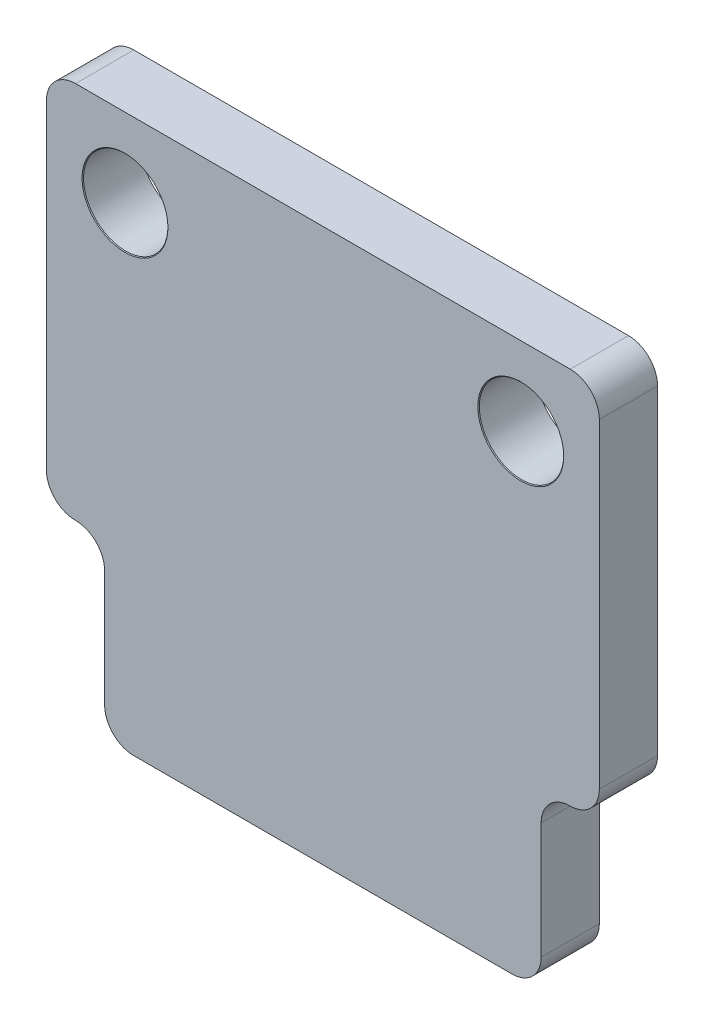
ISO-10303-21;
HEADER;
FILE_DESCRIPTION(('STEP AP214'),'2;1');
FILE_NAME('part.step','',(''),(''),'','','');
FILE_SCHEMA(('AUTOMOTIVE_DESIGN { 1 0 10303 214 1 1 1 1 }'));
ENDSEC;
DATA;
#1=APPLICATION_CONTEXT('core data for automotive mechanical design processes');
#2=APPLICATION_PROTOCOL_DEFINITION('international standard','automotive_design',2000,#1);
#3=PRODUCT_CONTEXT('',#1,'mechanical');
#4=PRODUCT('Part','Part','',(#3));
#5=PRODUCT_RELATED_PRODUCT_CATEGORY('part','',(#4));
#6=PRODUCT_DEFINITION_FORMATION('','',#4);
#7=PRODUCT_DEFINITION_CONTEXT('part definition',#1,'design');
#8=PRODUCT_DEFINITION('design','',#6,#7);
#9=PRODUCT_DEFINITION_SHAPE('','',#8);
#10=(LENGTH_UNIT() NAMED_UNIT(*) SI_UNIT(.MILLI.,.METRE.));
#11=(NAMED_UNIT(*) PLANE_ANGLE_UNIT() SI_UNIT($,.RADIAN.));
#12=(NAMED_UNIT(*) SI_UNIT($,.STERADIAN.) SOLID_ANGLE_UNIT());
#13=UNCERTAINTY_MEASURE_WITH_UNIT(LENGTH_MEASURE(1.E-05),#10,'distance_accuracy_value','');
#14=(GEOMETRIC_REPRESENTATION_CONTEXT(3) GLOBAL_UNCERTAINTY_ASSIGNED_CONTEXT((#13)) GLOBAL_UNIT_ASSIGNED_CONTEXT((#10,
#11,#12)) REPRESENTATION_CONTEXT('',''));
#15=CARTESIAN_POINT('',(0.,0.,0.));
#16=DIRECTION('',(0.,0.,1.));
#17=DIRECTION('',(1.,0.,0.));
#18=AXIS2_PLACEMENT_3D('',#15,#16,#17);
#19=CARTESIAN_POINT('',(7.5,0.,2.));
#20=DIRECTION('',(0.,1.,0.));
#21=DIRECTION('',(0.,0.,1.));
#22=AXIS2_PLACEMENT_3D('',#19,#20,#21);
#23=PLANE('',#22);
#24=DIRECTION('',(1.,0.,0.));
#25=VECTOR('',#24,1.);
#26=CARTESIAN_POINT('',(7.5,0.,0.));
#27=LINE('',#26,#25);
#28=CARTESIAN_POINT('',(-6.5,0.,0.));
#29=VERTEX_POINT('',#28);
#30=CARTESIAN_POINT('',(6.5,0.,0.));
#31=VERTEX_POINT('',#30);
#32=EDGE_CURVE('E227',#29,#31,#27,.T.);
#33=ORIENTED_EDGE('',*,*,#32,.T.);
#34=DIRECTION('',(0.,0.,-1.));
#35=VECTOR('',#34,1.);
#36=CARTESIAN_POINT('',(6.5,0.,2.));
#37=LINE('',#36,#35);
#38=CARTESIAN_POINT('',(6.5,0.,2.));
#39=VERTEX_POINT('',#38);
#40=EDGE_CURVE('E210',#31,#39,#37,.F.);
#41=ORIENTED_EDGE('',*,*,#40,.T.);
#42=DIRECTION('',(1.,0.,0.));
#43=VECTOR('',#42,1.);
#44=CARTESIAN_POINT('',(7.5,0.,2.));
#45=LINE('',#44,#43);
#46=CARTESIAN_POINT('',(-6.5,0.,2.));
#47=VERTEX_POINT('',#46);
#48=EDGE_CURVE('E176',#47,#39,#45,.T.);
#49=ORIENTED_EDGE('',*,*,#48,.F.);
#50=DIRECTION('',(0.,0.,-1.));
#51=VECTOR('',#50,1.);
#52=CARTESIAN_POINT('',(-6.5,0.,2.));
#53=LINE('',#52,#51);
#54=EDGE_CURVE('E207',#47,#29,#53,.T.);
#55=ORIENTED_EDGE('',*,*,#54,.T.);
#56=EDGE_LOOP('',(#33,#41,#49,#55));
#57=FACE_BOUND('',#56,.T.);
#58=ADVANCED_FACE('F37',(#57),#23,.F.);
#59=CARTESIAN_POINT('',(7.5,6.,2.));
#60=DIRECTION('',(-1.,0.,0.));
#61=DIRECTION('',(0.,-1.,0.));
#62=AXIS2_PLACEMENT_3D('',#59,#60,#61);
#63=PLANE('',#62);
#64=DIRECTION('',(0.,1.,0.));
#65=VECTOR('',#64,1.);
#66=CARTESIAN_POINT('',(7.5,6.,0.));
#67=LINE('',#66,#65);
#68=CARTESIAN_POINT('',(7.5,1.,0.));
#69=VERTEX_POINT('',#68);
#70=CARTESIAN_POINT('',(7.5,5.,0.));
#71=VERTEX_POINT('',#70);
#72=EDGE_CURVE('E171',#69,#71,#67,.T.);
#73=ORIENTED_EDGE('',*,*,#72,.T.);
#74=DIRECTION('',(0.,0.,-1.));
#75=VECTOR('',#74,1.);
#76=CARTESIAN_POINT('',(7.5,5.,2.));
#77=LINE('',#76,#75);
#78=CARTESIAN_POINT('',(7.5,5.,2.));
#79=VERTEX_POINT('',#78);
#80=EDGE_CURVE('E205',#71,#79,#77,.F.);
#81=ORIENTED_EDGE('',*,*,#80,.T.);
#82=DIRECTION('',(0.,1.,0.));
#83=VECTOR('',#82,1.);
#84=CARTESIAN_POINT('',(7.5,6.,2.));
#85=LINE('',#84,#83);
#86=CARTESIAN_POINT('',(7.5,1.,2.));
#87=VERTEX_POINT('',#86);
#88=EDGE_CURVE('E249',#87,#79,#85,.T.);
#89=ORIENTED_EDGE('',*,*,#88,.F.);
#90=DIRECTION('',(0.,0.,-1.));
#91=VECTOR('',#90,1.);
#92=CARTESIAN_POINT('',(7.5,1.,2.));
#93=LINE('',#92,#91);
#94=EDGE_CURVE('E202',#87,#69,#93,.T.);
#95=ORIENTED_EDGE('',*,*,#94,.T.);
#96=EDGE_LOOP('',(#73,#81,#89,#95));
#97=FACE_BOUND('',#96,.T.);
#98=ADVANCED_FACE('F263',(#97),#63,.F.);
#99=CARTESIAN_POINT('',(9.5,19.,2.));
#100=DIRECTION('',(-1.,0.,0.));
#101=DIRECTION('',(0.,-1.,0.));
#102=AXIS2_PLACEMENT_3D('',#99,#100,#101);
#103=PLANE('',#102);
#104=DIRECTION('',(0.,1.,0.));
#105=VECTOR('',#104,1.);
#106=CARTESIAN_POINT('',(9.5,19.,0.));
#107=LINE('',#106,#105);
#108=CARTESIAN_POINT('',(9.5,7.,0.));
#109=VERTEX_POINT('',#108);
#110=CARTESIAN_POINT('',(9.5,18.,0.));
#111=VERTEX_POINT('',#110);
#112=EDGE_CURVE('E166',#109,#111,#107,.T.);
#113=ORIENTED_EDGE('',*,*,#112,.T.);
#114=DIRECTION('',(0.,0.,-1.));
#115=VECTOR('',#114,1.);
#116=CARTESIAN_POINT('',(9.5,18.,2.));
#117=LINE('',#116,#115);
#118=CARTESIAN_POINT('',(9.5,18.,2.));
#119=VERTEX_POINT('',#118);
#120=EDGE_CURVE('E144',#111,#119,#117,.F.);
#121=ORIENTED_EDGE('',*,*,#120,.T.);
#122=DIRECTION('',(0.,1.,0.));
#123=VECTOR('',#122,1.);
#124=CARTESIAN_POINT('',(9.5,19.,2.));
#125=LINE('',#124,#123);
#126=CARTESIAN_POINT('',(9.5,7.,2.));
#127=VERTEX_POINT('',#126);
#128=EDGE_CURVE('E252',#127,#119,#125,.T.);
#129=ORIENTED_EDGE('',*,*,#128,.F.);
#130=DIRECTION('',(0.,0.,-1.));
#131=VECTOR('',#130,1.);
#132=CARTESIAN_POINT('',(9.5,7.,2.));
#133=LINE('',#132,#131);
#134=EDGE_CURVE('E149',#127,#109,#133,.T.);
#135=ORIENTED_EDGE('',*,*,#134,.T.);
#136=EDGE_LOOP('',(#113,#121,#129,#135));
#137=FACE_BOUND('',#136,.T.);
#138=ADVANCED_FACE('F313',(#137),#103,.F.);
#139=CARTESIAN_POINT('',(-9.5,19.,2.));
#140=DIRECTION('',(0.,-1.,0.));
#141=DIRECTION('',(0.,0.,-1.));
#142=AXIS2_PLACEMENT_3D('',#139,#140,#141);
#143=PLANE('',#142);
#144=DIRECTION('',(-1.,0.,0.));
#145=VECTOR('',#144,1.);
#146=CARTESIAN_POINT('',(-9.5,19.,2.));
#147=LINE('',#146,#145);
#148=CARTESIAN_POINT('',(8.5,19.,2.));
#149=VERTEX_POINT('',#148);
#150=CARTESIAN_POINT('',(-8.5,19.,2.));
#151=VERTEX_POINT('',#150);
#152=EDGE_CURVE('E159',#149,#151,#147,.T.);
#153=ORIENTED_EDGE('',*,*,#152,.F.);
#154=DIRECTION('',(0.,0.,-1.));
#155=VECTOR('',#154,1.);
#156=CARTESIAN_POINT('',(8.5,19.,2.));
#157=LINE('',#156,#155);
#158=CARTESIAN_POINT('',(8.5,19.,0.));
#159=VERTEX_POINT('',#158);
#160=EDGE_CURVE('E143',#149,#159,#157,.T.);
#161=ORIENTED_EDGE('',*,*,#160,.T.);
#162=DIRECTION('',(-1.,0.,0.));
#163=VECTOR('',#162,1.);
#164=CARTESIAN_POINT('',(-9.5,19.,0.));
#165=LINE('',#164,#163);
#166=CARTESIAN_POINT('',(-8.5,19.,0.));
#167=VERTEX_POINT('',#166);
#168=EDGE_CURVE('E156',#159,#167,#165,.T.);
#169=ORIENTED_EDGE('',*,*,#168,.T.);
#170=DIRECTION('',(0.,0.,-1.));
#171=VECTOR('',#170,1.);
#172=CARTESIAN_POINT('',(-8.5,19.,2.));
#173=LINE('',#172,#171);
#174=EDGE_CURVE('E161',#167,#151,#173,.F.);
#175=ORIENTED_EDGE('',*,*,#174,.T.);
#176=EDGE_LOOP('',(#153,#161,#169,#175));
#177=FACE_BOUND('',#176,.T.);
#178=ADVANCED_FACE('F155',(#177),#143,.F.);
#179=CARTESIAN_POINT('',(-9.5,19.,2.));
#180=DIRECTION('',(1.,0.,0.));
#181=DIRECTION('',(0.,1.,0.));
#182=AXIS2_PLACEMENT_3D('',#179,#180,#181);
#183=PLANE('',#182);
#184=DIRECTION('',(0.,-1.,0.));
#185=VECTOR('',#184,1.);
#186=CARTESIAN_POINT('',(-9.5,19.,0.));
#187=LINE('',#186,#185);
#188=CARTESIAN_POINT('',(-9.5,18.,0.));
#189=VERTEX_POINT('',#188);
#190=CARTESIAN_POINT('',(-9.5,7.,0.));
#191=VERTEX_POINT('',#190);
#192=EDGE_CURVE('E165',#189,#191,#187,.T.);
#193=ORIENTED_EDGE('',*,*,#192,.T.);
#194=DIRECTION('',(0.,0.,-1.));
#195=VECTOR('',#194,1.);
#196=CARTESIAN_POINT('',(-9.5,7.,2.));
#197=LINE('',#196,#195);
#198=CARTESIAN_POINT('',(-9.5,7.,2.));
#199=VERTEX_POINT('',#198);
#200=EDGE_CURVE('E219',#191,#199,#197,.F.);
#201=ORIENTED_EDGE('',*,*,#200,.T.);
#202=DIRECTION('',(0.,-1.,0.));
#203=VECTOR('',#202,1.);
#204=CARTESIAN_POINT('',(-9.5,19.,2.));
#205=LINE('',#204,#203);
#206=CARTESIAN_POINT('',(-9.5,18.,2.));
#207=VERTEX_POINT('',#206);
#208=EDGE_CURVE('E256',#207,#199,#205,.T.);
#209=ORIENTED_EDGE('',*,*,#208,.F.);
#210=DIRECTION('',(0.,0.,-1.));
#211=VECTOR('',#210,1.);
#212=CARTESIAN_POINT('',(-9.5,18.,2.));
#213=LINE('',#212,#211);
#214=EDGE_CURVE('E216',#207,#189,#213,.T.);
#215=ORIENTED_EDGE('',*,*,#214,.T.);
#216=EDGE_LOOP('',(#193,#201,#209,#215));
#217=FACE_BOUND('',#216,.T.);
#218=ADVANCED_FACE('F294',(#217),#183,.F.);
#219=CARTESIAN_POINT('',(-7.5,6.,2.));
#220=DIRECTION('',(1.,0.,0.));
#221=DIRECTION('',(0.,1.,0.));
#222=AXIS2_PLACEMENT_3D('',#219,#220,#221);
#223=PLANE('',#222);
#224=DIRECTION('',(0.,-1.,0.));
#225=VECTOR('',#224,1.);
#226=CARTESIAN_POINT('',(-7.5,6.,0.));
#227=LINE('',#226,#225);
#228=CARTESIAN_POINT('',(-7.5,5.,0.));
#229=VERTEX_POINT('',#228);
#230=CARTESIAN_POINT('',(-7.5,1.,0.));
#231=VERTEX_POINT('',#230);
#232=EDGE_CURVE('E169',#229,#231,#227,.T.);
#233=ORIENTED_EDGE('',*,*,#232,.T.);
#234=DIRECTION('',(0.,0.,-1.));
#235=VECTOR('',#234,1.);
#236=CARTESIAN_POINT('',(-7.5,1.,2.));
#237=LINE('',#236,#235);
#238=CARTESIAN_POINT('',(-7.5,1.,2.));
#239=VERTEX_POINT('',#238);
#240=EDGE_CURVE('E54',#231,#239,#237,.F.);
#241=ORIENTED_EDGE('',*,*,#240,.T.);
#242=DIRECTION('',(0.,-1.,0.));
#243=VECTOR('',#242,1.);
#244=CARTESIAN_POINT('',(-7.5,6.,2.));
#245=LINE('',#244,#243);
#246=CARTESIAN_POINT('',(-7.5,5.,2.));
#247=VERTEX_POINT('',#246);
#248=EDGE_CURVE('E177',#247,#239,#245,.T.);
#249=ORIENTED_EDGE('',*,*,#248,.F.);
#250=DIRECTION('',(0.,0.,-1.));
#251=VECTOR('',#250,1.);
#252=CARTESIAN_POINT('',(-7.5,5.,0.));
#253=LINE('',#252,#251);
#254=EDGE_CURVE('E212',#247,#229,#253,.T.);
#255=ORIENTED_EDGE('',*,*,#254,.T.);
#256=EDGE_LOOP('',(#233,#241,#249,#255));
#257=FACE_BOUND('',#256,.T.);
#258=ADVANCED_FACE('F284',(#257),#223,.F.);
#259=CARTESIAN_POINT('',(0.,0.,2.));
#260=DIRECTION('',(0.,0.,1.));
#261=DIRECTION('',(1.,0.,0.));
#262=AXIS2_PLACEMENT_3D('',#259,#260,#261);
#263=PLANE('',#262);
#264=CARTESIAN_POINT('',(-6.8,16.3,2.));
#265=DIRECTION('',(0.,0.,1.));
#266=DIRECTION('',(1.,0.,0.));
#267=AXIS2_PLACEMENT_3D('',#264,#265,#266);
#268=CIRCLE('',#267,1.475);
#269=CARTESIAN_POINT('',(-5.325,16.3,2.));
#270=VERTEX_POINT('',#269);
#271=EDGE_CURVE('E516',#270,#270,#268,.T.);
#272=ORIENTED_EDGE('',*,*,#271,.F.);
#273=EDGE_LOOP('',(#272));
#274=FACE_BOUND('',#273,.T.);
#275=CARTESIAN_POINT('',(6.8,16.3,2.));
#276=DIRECTION('',(0.,0.,1.));
#277=DIRECTION('',(1.,0.,0.));
#278=AXIS2_PLACEMENT_3D('',#275,#276,#277);
#279=CIRCLE('',#278,1.475);
#280=CARTESIAN_POINT('',(8.275,16.3,2.));
#281=VERTEX_POINT('',#280);
#282=EDGE_CURVE('E243',#281,#281,#279,.T.);
#283=ORIENTED_EDGE('',*,*,#282,.F.);
#284=EDGE_LOOP('',(#283));
#285=FACE_BOUND('',#284,.T.);
#286=ORIENTED_EDGE('',*,*,#128,.T.);
#287=CARTESIAN_POINT('',(8.5,18.,2.));
#288=DIRECTION('',(0.,0.,1.));
#289=DIRECTION('',(1.,0.,0.));
#290=AXIS2_PLACEMENT_3D('',#287,#288,#289);
#291=CIRCLE('',#290,1.);
#292=EDGE_CURVE('E200',#119,#149,#291,.T.);
#293=ORIENTED_EDGE('',*,*,#292,.T.);
#294=ORIENTED_EDGE('',*,*,#152,.T.);
#295=CARTESIAN_POINT('',(-8.5,18.,2.));
#296=DIRECTION('',(0.,0.,1.));
#297=DIRECTION('',(1.,0.,0.));
#298=AXIS2_PLACEMENT_3D('',#295,#296,#297);
#299=CIRCLE('',#298,1.);
#300=EDGE_CURVE('E190',#151,#207,#299,.T.);
#301=ORIENTED_EDGE('',*,*,#300,.T.);
#302=ORIENTED_EDGE('',*,*,#208,.T.);
#303=CARTESIAN_POINT('',(-8.5,7.,2.));
#304=DIRECTION('',(0.,0.,1.));
#305=DIRECTION('',(1.,0.,0.));
#306=AXIS2_PLACEMENT_3D('',#303,#304,#305);
#307=CIRCLE('',#306,1.);
#308=CARTESIAN_POINT('',(-8.5,6.,2.));
#309=VERTEX_POINT('',#308);
#310=EDGE_CURVE('E192',#199,#309,#307,.T.);
#311=ORIENTED_EDGE('',*,*,#310,.T.);
#312=CARTESIAN_POINT('',(-8.5,5.,2.));
#313=DIRECTION('',(0.,0.,1.));
#314=DIRECTION('',(1.,0.,0.));
#315=AXIS2_PLACEMENT_3D('',#312,#313,#314);
#316=CIRCLE('',#315,1.);
#317=EDGE_CURVE('E11',#309,#247,#316,.F.);
#318=ORIENTED_EDGE('',*,*,#317,.T.);
#319=ORIENTED_EDGE('',*,*,#248,.T.);
#320=CARTESIAN_POINT('',(-6.5,1.,2.));
#321=DIRECTION('',(0.,0.,1.));
#322=DIRECTION('',(1.,0.,0.));
#323=AXIS2_PLACEMENT_3D('',#320,#321,#322);
#324=CIRCLE('',#323,1.);
#325=EDGE_CURVE('E194',#239,#47,#324,.T.);
#326=ORIENTED_EDGE('',*,*,#325,.T.);
#327=ORIENTED_EDGE('',*,*,#48,.T.);
#328=CARTESIAN_POINT('',(6.5,1.,2.));
#329=DIRECTION('',(0.,0.,1.));
#330=DIRECTION('',(1.,0.,0.));
#331=AXIS2_PLACEMENT_3D('',#328,#329,#330);
#332=CIRCLE('',#331,1.);
#333=EDGE_CURVE('E196',#39,#87,#332,.T.);
#334=ORIENTED_EDGE('',*,*,#333,.T.);
#335=ORIENTED_EDGE('',*,*,#88,.T.);
#336=CARTESIAN_POINT('',(8.5,5.,2.));
#337=DIRECTION('',(0.,0.,1.));
#338=DIRECTION('',(1.,0.,0.));
#339=AXIS2_PLACEMENT_3D('',#336,#337,#338);
#340=CIRCLE('',#339,1.);
#341=CARTESIAN_POINT('',(8.5,6.,2.));
#342=VERTEX_POINT('',#341);
#343=EDGE_CURVE('E223',#79,#342,#340,.F.);
#344=ORIENTED_EDGE('',*,*,#343,.T.);
#345=CARTESIAN_POINT('',(8.5,7.,2.));
#346=DIRECTION('',(0.,0.,1.));
#347=DIRECTION('',(1.,0.,0.));
#348=AXIS2_PLACEMENT_3D('',#345,#346,#347);
#349=CIRCLE('',#348,1.);
#350=EDGE_CURVE('E198',#342,#127,#349,.T.);
#351=ORIENTED_EDGE('',*,*,#350,.T.);
#352=EDGE_LOOP('',(#286,#293,#294,#301,#302,#311,#318,#319,#326,#327,#334,#335,#344,#351));
#353=FACE_BOUND('',#352,.T.);
#354=ADVANCED_FACE('F270',(#274,#285,#353),#263,.T.);
#355=CARTESIAN_POINT('',(0.,0.,0.));
#356=DIRECTION('',(0.,0.,1.));
#357=DIRECTION('',(1.,0.,0.));
#358=AXIS2_PLACEMENT_3D('',#355,#356,#357);
#359=PLANE('',#358);
#360=CARTESIAN_POINT('',(-6.8,16.3,0.));
#361=DIRECTION('',(0.,0.,1.));
#362=DIRECTION('',(1.,0.,0.));
#363=AXIS2_PLACEMENT_3D('',#360,#361,#362);
#364=CIRCLE('',#363,1.45);
#365=CARTESIAN_POINT('',(-5.35,16.3,0.));
#366=VERTEX_POINT('',#365);
#367=EDGE_CURVE('E518',#366,#366,#364,.T.);
#368=ORIENTED_EDGE('',*,*,#367,.T.);
#369=EDGE_LOOP('',(#368));
#370=FACE_BOUND('',#369,.T.);
#371=CARTESIAN_POINT('',(6.8,16.3,0.));
#372=DIRECTION('',(0.,0.,1.));
#373=DIRECTION('',(1.,0.,0.));
#374=AXIS2_PLACEMENT_3D('',#371,#372,#373);
#375=CIRCLE('',#374,1.45);
#376=CARTESIAN_POINT('',(8.25,16.3,0.));
#377=VERTEX_POINT('',#376);
#378=EDGE_CURVE('E234',#377,#377,#375,.T.);
#379=ORIENTED_EDGE('',*,*,#378,.T.);
#380=EDGE_LOOP('',(#379));
#381=FACE_BOUND('',#380,.T.);
#382=ORIENTED_EDGE('',*,*,#168,.F.);
#383=CARTESIAN_POINT('',(8.5,18.,0.));
#384=DIRECTION('',(0.,0.,1.));
#385=DIRECTION('',(1.,0.,0.));
#386=AXIS2_PLACEMENT_3D('',#383,#384,#385);
#387=CIRCLE('',#386,1.);
#388=EDGE_CURVE('E139',#159,#111,#387,.F.);
#389=ORIENTED_EDGE('',*,*,#388,.T.);
#390=ORIENTED_EDGE('',*,*,#112,.F.);
#391=CARTESIAN_POINT('',(8.5,7.,0.));
#392=DIRECTION('',(0.,0.,1.));
#393=DIRECTION('',(1.,0.,0.));
#394=AXIS2_PLACEMENT_3D('',#391,#392,#393);
#395=CIRCLE('',#394,1.);
#396=CARTESIAN_POINT('',(8.5,6.,0.));
#397=VERTEX_POINT('',#396);
#398=EDGE_CURVE('E150',#109,#397,#395,.F.);
#399=ORIENTED_EDGE('',*,*,#398,.T.);
#400=CARTESIAN_POINT('',(8.5,5.,0.));
#401=DIRECTION('',(0.,0.,1.));
#402=DIRECTION('',(1.,0.,0.));
#403=AXIS2_PLACEMENT_3D('',#400,#401,#402);
#404=CIRCLE('',#403,1.);
#405=EDGE_CURVE('E221',#397,#71,#404,.T.);
#406=ORIENTED_EDGE('',*,*,#405,.T.);
#407=ORIENTED_EDGE('',*,*,#72,.F.);
#408=CARTESIAN_POINT('',(6.5,1.,0.));
#409=DIRECTION('',(0.,0.,1.));
#410=DIRECTION('',(1.,0.,0.));
#411=AXIS2_PLACEMENT_3D('',#408,#409,#410);
#412=CIRCLE('',#411,1.);
#413=EDGE_CURVE('E184',#69,#31,#412,.F.);
#414=ORIENTED_EDGE('',*,*,#413,.T.);
#415=ORIENTED_EDGE('',*,*,#32,.F.);
#416=CARTESIAN_POINT('',(-6.5,1.,0.));
#417=DIRECTION('',(0.,0.,1.));
#418=DIRECTION('',(1.,0.,0.));
#419=AXIS2_PLACEMENT_3D('',#416,#417,#418);
#420=CIRCLE('',#419,1.);
#421=EDGE_CURVE('E182',#29,#231,#420,.F.);
#422=ORIENTED_EDGE('',*,*,#421,.T.);
#423=ORIENTED_EDGE('',*,*,#232,.F.);
#424=CARTESIAN_POINT('',(-8.5,5.,0.));
#425=DIRECTION('',(0.,0.,1.));
#426=DIRECTION('',(1.,0.,0.));
#427=AXIS2_PLACEMENT_3D('',#424,#425,#426);
#428=CIRCLE('',#427,1.);
#429=CARTESIAN_POINT('',(-8.5,6.,0.));
#430=VERTEX_POINT('',#429);
#431=EDGE_CURVE('E46',#229,#430,#428,.T.);
#432=ORIENTED_EDGE('',*,*,#431,.T.);
#433=CARTESIAN_POINT('',(-8.5,7.,0.));
#434=DIRECTION('',(0.,0.,1.));
#435=DIRECTION('',(1.,0.,0.));
#436=AXIS2_PLACEMENT_3D('',#433,#434,#435);
#437=CIRCLE('',#436,1.);
#438=EDGE_CURVE('E180',#430,#191,#437,.F.);
#439=ORIENTED_EDGE('',*,*,#438,.T.);
#440=ORIENTED_EDGE('',*,*,#192,.F.);
#441=CARTESIAN_POINT('',(-8.5,18.,0.));
#442=DIRECTION('',(0.,0.,1.));
#443=DIRECTION('',(1.,0.,0.));
#444=AXIS2_PLACEMENT_3D('',#441,#442,#443);
#445=CIRCLE('',#444,1.);
#446=EDGE_CURVE('E160',#189,#167,#445,.F.);
#447=ORIENTED_EDGE('',*,*,#446,.T.);
#448=EDGE_LOOP('',(#382,#389,#390,#399,#406,#407,#414,#415,#422,#423,#432,#439,#440,#447));
#449=FACE_BOUND('',#448,.T.);
#450=ADVANCED_FACE('F163',(#370,#381,#449),#359,.F.);
#451=CARTESIAN_POINT('',(8.5,18.,2.));
#452=DIRECTION('',(0.,0.,-1.));
#453=DIRECTION('',(-1.,0.,0.));
#454=AXIS2_PLACEMENT_3D('',#451,#452,#453);
#455=CYLINDRICAL_SURFACE('',#454,1.);
#456=ORIENTED_EDGE('',*,*,#292,.F.);
#457=ORIENTED_EDGE('',*,*,#120,.F.);
#458=ORIENTED_EDGE('',*,*,#388,.F.);
#459=ORIENTED_EDGE('',*,*,#160,.F.);
#460=EDGE_LOOP('',(#456,#457,#458,#459));
#461=FACE_BOUND('',#460,.T.);
#462=ADVANCED_FACE('F142',(#461),#455,.T.);
#463=CARTESIAN_POINT('',(8.5,5.,2.));
#464=DIRECTION('',(0.,0.,1.));
#465=DIRECTION('',(1.,0.,0.));
#466=AXIS2_PLACEMENT_3D('',#463,#464,#465);
#467=CYLINDRICAL_SURFACE('',#466,1.);
#468=DIRECTION('',(0.,0.,-1.));
#469=VECTOR('',#468,1.);
#470=CARTESIAN_POINT('',(8.5,6.,0.));
#471=LINE('',#470,#469);
#472=EDGE_CURVE('E225',#342,#397,#471,.T.);
#473=ORIENTED_EDGE('',*,*,#472,.F.);
#474=ORIENTED_EDGE('',*,*,#343,.F.);
#475=ORIENTED_EDGE('',*,*,#80,.F.);
#476=ORIENTED_EDGE('',*,*,#405,.F.);
#477=EDGE_LOOP('',(#473,#474,#475,#476));
#478=FACE_BOUND('',#477,.T.);
#479=ADVANCED_FACE('F269',(#478),#467,.F.);
#480=CARTESIAN_POINT('',(8.5,7.,2.));
#481=DIRECTION('',(0.,0.,-1.));
#482=DIRECTION('',(-1.,0.,0.));
#483=AXIS2_PLACEMENT_3D('',#480,#481,#482);
#484=CYLINDRICAL_SURFACE('',#483,1.);
#485=ORIENTED_EDGE('',*,*,#350,.F.);
#486=ORIENTED_EDGE('',*,*,#472,.T.);
#487=ORIENTED_EDGE('',*,*,#398,.F.);
#488=ORIENTED_EDGE('',*,*,#134,.F.);
#489=EDGE_LOOP('',(#485,#486,#487,#488));
#490=FACE_BOUND('',#489,.T.);
#491=ADVANCED_FACE('F319',(#490),#484,.T.);
#492=CARTESIAN_POINT('',(6.5,1.,2.));
#493=DIRECTION('',(0.,0.,-1.));
#494=DIRECTION('',(-1.,0.,0.));
#495=AXIS2_PLACEMENT_3D('',#492,#493,#494);
#496=CYLINDRICAL_SURFACE('',#495,1.);
#497=ORIENTED_EDGE('',*,*,#333,.F.);
#498=ORIENTED_EDGE('',*,*,#40,.F.);
#499=ORIENTED_EDGE('',*,*,#413,.F.);
#500=ORIENTED_EDGE('',*,*,#94,.F.);
#501=EDGE_LOOP('',(#497,#498,#499,#500));
#502=FACE_BOUND('',#501,.T.);
#503=ADVANCED_FACE('F274',(#502),#496,.T.);
#504=CARTESIAN_POINT('',(-6.5,1.,2.));
#505=DIRECTION('',(0.,0.,-1.));
#506=DIRECTION('',(-1.,0.,0.));
#507=AXIS2_PLACEMENT_3D('',#504,#505,#506);
#508=CYLINDRICAL_SURFACE('',#507,1.);
#509=ORIENTED_EDGE('',*,*,#325,.F.);
#510=ORIENTED_EDGE('',*,*,#240,.F.);
#511=ORIENTED_EDGE('',*,*,#421,.F.);
#512=ORIENTED_EDGE('',*,*,#54,.F.);
#513=EDGE_LOOP('',(#509,#510,#511,#512));
#514=FACE_BOUND('',#513,.T.);
#515=ADVANCED_FACE('F282',(#514),#508,.T.);
#516=CARTESIAN_POINT('',(-8.5,7.,2.));
#517=DIRECTION('',(0.,0.,-1.));
#518=DIRECTION('',(-1.,0.,0.));
#519=AXIS2_PLACEMENT_3D('',#516,#517,#518);
#520=CYLINDRICAL_SURFACE('',#519,1.);
#521=DIRECTION('',(0.,0.,-1.));
#522=VECTOR('',#521,1.);
#523=CARTESIAN_POINT('',(-8.5,6.,2.));
#524=LINE('',#523,#522);
#525=EDGE_CURVE('E41',#309,#430,#524,.T.);
#526=ORIENTED_EDGE('',*,*,#525,.F.);
#527=ORIENTED_EDGE('',*,*,#310,.F.);
#528=ORIENTED_EDGE('',*,*,#200,.F.);
#529=ORIENTED_EDGE('',*,*,#438,.F.);
#530=EDGE_LOOP('',(#526,#527,#528,#529));
#531=FACE_BOUND('',#530,.T.);
#532=ADVANCED_FACE('F290',(#531),#520,.T.);
#533=CARTESIAN_POINT('',(-8.5,5.,2.));
#534=DIRECTION('',(0.,0.,1.));
#535=DIRECTION('',(1.,0.,0.));
#536=AXIS2_PLACEMENT_3D('',#533,#534,#535);
#537=CYLINDRICAL_SURFACE('',#536,1.);
#538=ORIENTED_EDGE('',*,*,#317,.F.);
#539=ORIENTED_EDGE('',*,*,#525,.T.);
#540=ORIENTED_EDGE('',*,*,#431,.F.);
#541=ORIENTED_EDGE('',*,*,#254,.F.);
#542=EDGE_LOOP('',(#538,#539,#540,#541));
#543=FACE_BOUND('',#542,.T.);
#544=ADVANCED_FACE('F286',(#543),#537,.F.);
#545=CARTESIAN_POINT('',(-8.5,18.,2.));
#546=DIRECTION('',(0.,0.,-1.));
#547=DIRECTION('',(-1.,0.,0.));
#548=AXIS2_PLACEMENT_3D('',#545,#546,#547);
#549=CYLINDRICAL_SURFACE('',#548,1.);
#550=ORIENTED_EDGE('',*,*,#300,.F.);
#551=ORIENTED_EDGE('',*,*,#174,.F.);
#552=ORIENTED_EDGE('',*,*,#446,.F.);
#553=ORIENTED_EDGE('',*,*,#214,.F.);
#554=EDGE_LOOP('',(#550,#551,#552,#553));
#555=FACE_BOUND('',#554,.T.);
#556=ADVANCED_FACE('F39',(#555),#549,.T.);
#557=CARTESIAN_POINT('',(6.8,16.3,2.));
#558=DIRECTION('',(0.,0.,1.));
#559=DIRECTION('',(1.,0.,0.));
#560=AXIS2_PLACEMENT_3D('',#557,#558,#559);
#561=CYLINDRICAL_SURFACE('',#560,1.45);
#562=ORIENTED_EDGE('',*,*,#378,.F.);
#563=EDGE_LOOP('',(#562));
#564=FACE_BOUND('',#563,.T.);
#565=CARTESIAN_POINT('',(6.8,16.3,1.975));
#566=DIRECTION('',(0.,0.,1.));
#567=DIRECTION('',(1.,0.,0.));
#568=AXIS2_PLACEMENT_3D('',#565,#566,#567);
#569=CIRCLE('',#568,1.45);
#570=CARTESIAN_POINT('',(8.25,16.3,1.975));
#571=VERTEX_POINT('',#570);
#572=EDGE_CURVE('E238',#571,#571,#569,.T.);
#573=ORIENTED_EDGE('',*,*,#572,.T.);
#574=EDGE_LOOP('',(#573));
#575=FACE_BOUND('',#574,.T.);
#576=ADVANCED_FACE('F299',(#564,#575),#561,.F.);
#577=CARTESIAN_POINT('',(6.8,16.3,2.));
#578=DIRECTION('',(0.,0.,1.));
#579=DIRECTION('',(1.,0.,0.));
#580=AXIS2_PLACEMENT_3D('',#577,#578,#579);
#581=CONICAL_SURFACE('',#580,1.475,0.785398163397474);
#582=ORIENTED_EDGE('',*,*,#572,.F.);
#583=EDGE_LOOP('',(#582));
#584=FACE_BOUND('',#583,.T.);
#585=ORIENTED_EDGE('',*,*,#282,.T.);
#586=EDGE_LOOP('',(#585));
#587=FACE_BOUND('',#586,.T.);
#588=ADVANCED_FACE('F304',(#584,#587),#581,.F.);
#589=CARTESIAN_POINT('',(-6.8,16.3,2.));
#590=DIRECTION('',(0.,0.,1.));
#591=DIRECTION('',(1.,0.,0.));
#592=AXIS2_PLACEMENT_3D('',#589,#590,#591);
#593=CYLINDRICAL_SURFACE('',#592,1.45);
#594=ORIENTED_EDGE('',*,*,#367,.F.);
#595=EDGE_LOOP('',(#594));
#596=FACE_BOUND('',#595,.T.);
#597=CARTESIAN_POINT('',(-6.8,16.3,1.975));
#598=DIRECTION('',(0.,0.,1.));
#599=DIRECTION('',(1.,0.,0.));
#600=AXIS2_PLACEMENT_3D('',#597,#598,#599);
#601=CIRCLE('',#600,1.45);
#602=CARTESIAN_POINT('',(-5.35,16.3,1.975));
#603=VERTEX_POINT('',#602);
#604=EDGE_CURVE('E513',#603,#603,#601,.T.);
#605=ORIENTED_EDGE('',*,*,#604,.T.);
#606=EDGE_LOOP('',(#605));
#607=FACE_BOUND('',#606,.T.);
#608=ADVANCED_FACE('F381',(#596,#607),#593,.F.);
#609=CARTESIAN_POINT('',(-6.8,16.3,2.));
#610=DIRECTION('',(0.,0.,1.));
#611=DIRECTION('',(1.,0.,0.));
#612=AXIS2_PLACEMENT_3D('',#609,#610,#611);
#613=CONICAL_SURFACE('',#612,1.475,0.785398163397457);
#614=ORIENTED_EDGE('',*,*,#604,.F.);
#615=EDGE_LOOP('',(#614));
#616=FACE_BOUND('',#615,.T.);
#617=ORIENTED_EDGE('',*,*,#271,.T.);
#618=EDGE_LOOP('',(#617));
#619=FACE_BOUND('',#618,.T.);
#620=ADVANCED_FACE('F392',(#616,#619),#613,.F.);
#621=CLOSED_SHELL('',(#58,#98,#138,#178,#218,#258,#354,#450,#462,#479,#491,#503,#515,#532,#544,
#556,#576,#588,#608,#620));
#622=MANIFOLD_SOLID_BREP('B2',#621);
#623=ADVANCED_BREP_SHAPE_REPRESENTATION('',(#18,#622),#14);
#624=SHAPE_DEFINITION_REPRESENTATION(#9,#623);
ENDSEC;
END-ISO-10303-21;
